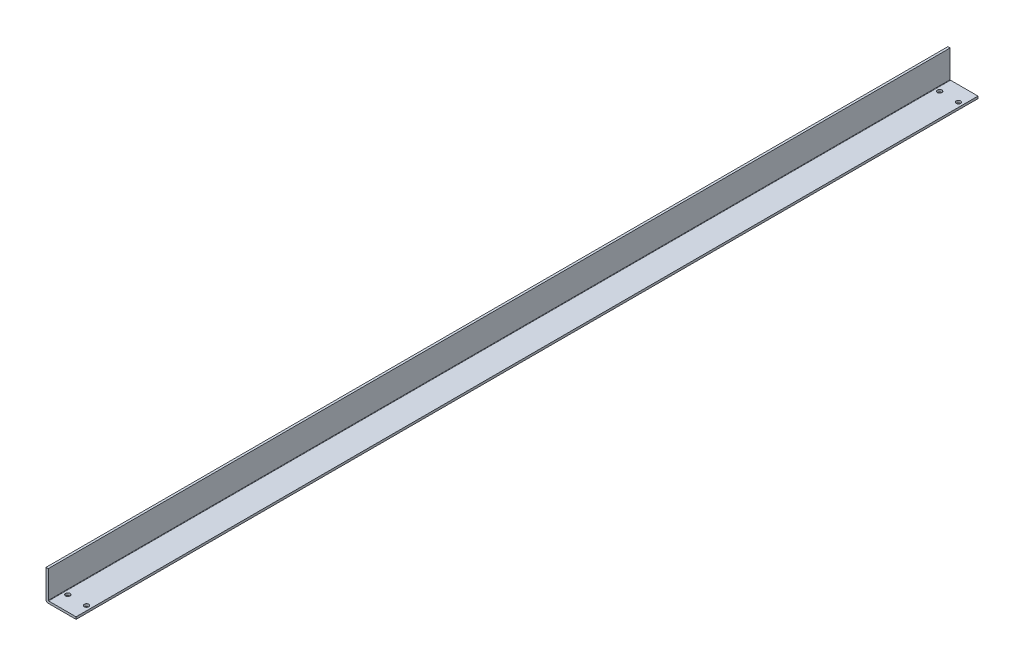
ISO-10303-21;
HEADER;
FILE_DESCRIPTION(('STEP AP214'),'2;1');
FILE_NAME('part.step','',(''),(''),'','','');
FILE_SCHEMA(('AUTOMOTIVE_DESIGN { 1 0 10303 214 1 1 1 1 }'));
ENDSEC;
DATA;
#1=APPLICATION_CONTEXT('core data for automotive mechanical design processes');
#2=APPLICATION_PROTOCOL_DEFINITION('international standard','automotive_design',2000,#1);
#3=PRODUCT_CONTEXT('',#1,'mechanical');
#4=PRODUCT('Part','Part','',(#3));
#5=PRODUCT_RELATED_PRODUCT_CATEGORY('part','',(#4));
#6=PRODUCT_DEFINITION_FORMATION('','',#4);
#7=PRODUCT_DEFINITION_CONTEXT('part definition',#1,'design');
#8=PRODUCT_DEFINITION('design','',#6,#7);
#9=PRODUCT_DEFINITION_SHAPE('','',#8);
#10=(LENGTH_UNIT() NAMED_UNIT(*) SI_UNIT(.MILLI.,.METRE.));
#11=(NAMED_UNIT(*) PLANE_ANGLE_UNIT() SI_UNIT($,.RADIAN.));
#12=(NAMED_UNIT(*) SI_UNIT($,.STERADIAN.) SOLID_ANGLE_UNIT());
#13=UNCERTAINTY_MEASURE_WITH_UNIT(LENGTH_MEASURE(1.E-05),#10,'distance_accuracy_value','');
#14=(GEOMETRIC_REPRESENTATION_CONTEXT(3) GLOBAL_UNCERTAINTY_ASSIGNED_CONTEXT((#13)) GLOBAL_UNIT_ASSIGNED_CONTEXT((#10,
#11,#12)) REPRESENTATION_CONTEXT('',''));
#15=CARTESIAN_POINT('',(0.,0.,0.));
#16=DIRECTION('',(0.,0.,1.));
#17=DIRECTION('',(1.,0.,0.));
#18=AXIS2_PLACEMENT_3D('',#15,#16,#17);
#19=CARTESIAN_POINT('',(0.,40.,1200.));
#20=DIRECTION('',(0.,-1.,0.));
#21=DIRECTION('',(0.,0.,-1.));
#22=AXIS2_PLACEMENT_3D('',#19,#20,#21);
#23=PLANE('',#22);
#24=DIRECTION('',(-1.,0.,0.));
#25=VECTOR('',#24,1.);
#26=CARTESIAN_POINT('',(0.,40.,0.));
#27=LINE('',#26,#25);
#28=CARTESIAN_POINT('',(3.,40.,0.));
#29=VERTEX_POINT('',#28);
#30=CARTESIAN_POINT('',(0.,40.,0.));
#31=VERTEX_POINT('',#30);
#32=EDGE_CURVE('E128',#29,#31,#27,.T.);
#33=ORIENTED_EDGE('',*,*,#32,.T.);
#34=DIRECTION('',(0.,0.,-1.));
#35=VECTOR('',#34,1.);
#36=CARTESIAN_POINT('',(0.,40.,1200.));
#37=LINE('',#36,#35);
#38=CARTESIAN_POINT('',(0.,40.,1200.));
#39=VERTEX_POINT('',#38);
#40=EDGE_CURVE('E11',#39,#31,#37,.T.);
#41=ORIENTED_EDGE('',*,*,#40,.F.);
#42=DIRECTION('',(-1.,0.,0.));
#43=VECTOR('',#42,1.);
#44=CARTESIAN_POINT('',(0.,40.,1200.));
#45=LINE('',#44,#43);
#46=CARTESIAN_POINT('',(3.,40.,1200.));
#47=VERTEX_POINT('',#46);
#48=EDGE_CURVE('E143',#47,#39,#45,.T.);
#49=ORIENTED_EDGE('',*,*,#48,.F.);
#50=DIRECTION('',(0.,0.,-1.));
#51=VECTOR('',#50,1.);
#52=CARTESIAN_POINT('',(3.,40.,1200.));
#53=LINE('',#52,#51);
#54=EDGE_CURVE('E124',#47,#29,#53,.T.);
#55=ORIENTED_EDGE('',*,*,#54,.T.);
#56=EDGE_LOOP('',(#33,#41,#49,#55));
#57=FACE_BOUND('',#56,.T.);
#58=ADVANCED_FACE('F32',(#57),#23,.F.);
#59=CARTESIAN_POINT('',(0.,3.00000000000002,1200.));
#60=DIRECTION('',(1.,0.,0.));
#61=DIRECTION('',(0.,0.,-1.));
#62=AXIS2_PLACEMENT_3D('',#59,#60,#61);
#63=PLANE('',#62);
#64=DIRECTION('',(0.,-1.,0.));
#65=VECTOR('',#64,1.);
#66=CARTESIAN_POINT('',(0.,3.00000000000002,0.));
#67=LINE('',#66,#65);
#68=CARTESIAN_POINT('',(0.,3.00000000000002,0.));
#69=VERTEX_POINT('',#68);
#70=EDGE_CURVE('E131',#31,#69,#67,.T.);
#71=ORIENTED_EDGE('',*,*,#70,.T.);
#72=DIRECTION('',(0.,0.,-1.));
#73=VECTOR('',#72,1.);
#74=CARTESIAN_POINT('',(0.,3.00000000000002,1200.));
#75=LINE('',#74,#73);
#76=CARTESIAN_POINT('',(0.,3.00000000000002,1200.));
#77=VERTEX_POINT('',#76);
#78=EDGE_CURVE('E40',#77,#69,#75,.T.);
#79=ORIENTED_EDGE('',*,*,#78,.F.);
#80=DIRECTION('',(0.,-1.,0.));
#81=VECTOR('',#80,1.);
#82=CARTESIAN_POINT('',(0.,3.00000000000002,1200.));
#83=LINE('',#82,#81);
#84=EDGE_CURVE('E91',#39,#77,#83,.T.);
#85=ORIENTED_EDGE('',*,*,#84,.F.);
#86=ORIENTED_EDGE('',*,*,#40,.T.);
#87=EDGE_LOOP('',(#71,#79,#85,#86));
#88=FACE_BOUND('',#87,.T.);
#89=ADVANCED_FACE('F227',(#88),#63,.F.);
#90=CARTESIAN_POINT('',(3.,3.,1200.));
#91=DIRECTION('',(0.,0.,-1.));
#92=DIRECTION('',(-1.,0.,0.));
#93=AXIS2_PLACEMENT_3D('',#90,#91,#92);
#94=CYLINDRICAL_SURFACE('',#93,3.);
#95=CARTESIAN_POINT('',(3.,3.,0.));
#96=DIRECTION('',(0.,0.,1.));
#97=DIRECTION('',(1.,0.,0.));
#98=AXIS2_PLACEMENT_3D('',#95,#96,#97);
#99=CIRCLE('',#98,3.);
#100=CARTESIAN_POINT('',(3.00000000000002,0.,0.));
#101=VERTEX_POINT('',#100);
#102=EDGE_CURVE('E134',#69,#101,#99,.T.);
#103=ORIENTED_EDGE('',*,*,#102,.T.);
#104=DIRECTION('',(0.,0.,-1.));
#105=VECTOR('',#104,1.);
#106=CARTESIAN_POINT('',(3.00000000000002,0.,1200.));
#107=LINE('',#106,#105);
#108=CARTESIAN_POINT('',(3.00000000000002,0.,1200.));
#109=VERTEX_POINT('',#108);
#110=EDGE_CURVE('E150',#109,#101,#107,.T.);
#111=ORIENTED_EDGE('',*,*,#110,.F.);
#112=CARTESIAN_POINT('',(3.,3.,1200.));
#113=DIRECTION('',(0.,0.,1.));
#114=DIRECTION('',(1.,0.,0.));
#115=AXIS2_PLACEMENT_3D('',#112,#113,#114);
#116=CIRCLE('',#115,3.);
#117=EDGE_CURVE('E158',#77,#109,#116,.T.);
#118=ORIENTED_EDGE('',*,*,#117,.F.);
#119=ORIENTED_EDGE('',*,*,#78,.T.);
#120=EDGE_LOOP('',(#103,#111,#118,#119));
#121=FACE_BOUND('',#120,.T.);
#122=ADVANCED_FACE('F156',(#121),#94,.T.);
#123=CARTESIAN_POINT('',(40.,0.,1200.));
#124=DIRECTION('',(0.,1.,0.));
#125=DIRECTION('',(0.,0.,1.));
#126=AXIS2_PLACEMENT_3D('',#123,#124,#125);
#127=PLANE('',#126);
#128=CARTESIAN_POINT('',(34.,0.,1180.));
#129=DIRECTION('',(0.,1.,0.));
#130=DIRECTION('',(0.,0.,1.));
#131=AXIS2_PLACEMENT_3D('',#128,#129,#130);
#132=CIRCLE('',#131,3.);
#133=CARTESIAN_POINT('',(34.,0.,1183.));
#134=VERTEX_POINT('',#133);
#135=EDGE_CURVE('E181',#134,#134,#132,.F.);
#136=ORIENTED_EDGE('',*,*,#135,.F.);
#137=EDGE_LOOP('',(#136));
#138=FACE_BOUND('',#137,.T.);
#139=CARTESIAN_POINT('',(9.,0.,20.));
#140=DIRECTION('',(0.,1.,0.));
#141=DIRECTION('',(0.,0.,1.));
#142=AXIS2_PLACEMENT_3D('',#139,#140,#141);
#143=CIRCLE('',#142,3.);
#144=CARTESIAN_POINT('',(9.,0.,23.));
#145=VERTEX_POINT('',#144);
#146=EDGE_CURVE('E189',#145,#145,#143,.F.);
#147=ORIENTED_EDGE('',*,*,#146,.F.);
#148=EDGE_LOOP('',(#147));
#149=FACE_BOUND('',#148,.T.);
#150=CARTESIAN_POINT('',(34.,0.,20.));
#151=DIRECTION('',(0.,1.,0.));
#152=DIRECTION('',(0.,0.,1.));
#153=AXIS2_PLACEMENT_3D('',#150,#151,#152);
#154=CIRCLE('',#153,3.);
#155=CARTESIAN_POINT('',(34.,0.,23.));
#156=VERTEX_POINT('',#155);
#157=EDGE_CURVE('E182',#156,#156,#154,.F.);
#158=ORIENTED_EDGE('',*,*,#157,.F.);
#159=EDGE_LOOP('',(#158));
#160=FACE_BOUND('',#159,.T.);
#161=CARTESIAN_POINT('',(9.,0.,1180.));
#162=DIRECTION('',(0.,1.,0.));
#163=DIRECTION('',(0.,0.,1.));
#164=AXIS2_PLACEMENT_3D('',#161,#162,#163);
#165=CIRCLE('',#164,3.);
#166=CARTESIAN_POINT('',(9.,0.,1183.));
#167=VERTEX_POINT('',#166);
#168=EDGE_CURVE('E132',#167,#167,#165,.F.);
#169=ORIENTED_EDGE('',*,*,#168,.F.);
#170=EDGE_LOOP('',(#169));
#171=FACE_BOUND('',#170,.T.);
#172=DIRECTION('',(1.,0.,0.));
#173=VECTOR('',#172,1.);
#174=CARTESIAN_POINT('',(40.,0.,0.));
#175=LINE('',#174,#173);
#176=CARTESIAN_POINT('',(40.,0.,0.));
#177=VERTEX_POINT('',#176);
#178=EDGE_CURVE('E136',#101,#177,#175,.T.);
#179=ORIENTED_EDGE('',*,*,#178,.T.);
#180=DIRECTION('',(0.,0.,-1.));
#181=VECTOR('',#180,1.);
#182=CARTESIAN_POINT('',(40.,0.,1200.));
#183=LINE('',#182,#181);
#184=CARTESIAN_POINT('',(40.,0.,1200.));
#185=VERTEX_POINT('',#184);
#186=EDGE_CURVE('E147',#185,#177,#183,.T.);
#187=ORIENTED_EDGE('',*,*,#186,.F.);
#188=DIRECTION('',(1.,0.,0.));
#189=VECTOR('',#188,1.);
#190=CARTESIAN_POINT('',(40.,0.,1200.));
#191=LINE('',#190,#189);
#192=EDGE_CURVE('E170',#109,#185,#191,.T.);
#193=ORIENTED_EDGE('',*,*,#192,.F.);
#194=ORIENTED_EDGE('',*,*,#110,.T.);
#195=EDGE_LOOP('',(#179,#187,#193,#194));
#196=FACE_BOUND('',#195,.T.);
#197=ADVANCED_FACE('F166',(#138,#149,#160,#171,#196),#127,.F.);
#198=CARTESIAN_POINT('',(40.,3.,1200.));
#199=DIRECTION('',(-1.,0.,0.));
#200=DIRECTION('',(0.,0.,1.));
#201=AXIS2_PLACEMENT_3D('',#198,#199,#200);
#202=PLANE('',#201);
#203=DIRECTION('',(0.,1.,0.));
#204=VECTOR('',#203,1.);
#205=CARTESIAN_POINT('',(40.,3.,0.));
#206=LINE('',#205,#204);
#207=CARTESIAN_POINT('',(40.,3.,0.));
#208=VERTEX_POINT('',#207);
#209=EDGE_CURVE('E138',#177,#208,#206,.T.);
#210=ORIENTED_EDGE('',*,*,#209,.T.);
#211=DIRECTION('',(0.,0.,-1.));
#212=VECTOR('',#211,1.);
#213=CARTESIAN_POINT('',(40.,3.,1200.));
#214=LINE('',#213,#212);
#215=CARTESIAN_POINT('',(40.,3.,1200.));
#216=VERTEX_POINT('',#215);
#217=EDGE_CURVE('E119',#216,#208,#214,.T.);
#218=ORIENTED_EDGE('',*,*,#217,.F.);
#219=DIRECTION('',(0.,1.,0.));
#220=VECTOR('',#219,1.);
#221=CARTESIAN_POINT('',(40.,3.,1200.));
#222=LINE('',#221,#220);
#223=EDGE_CURVE('E110',#185,#216,#222,.T.);
#224=ORIENTED_EDGE('',*,*,#223,.F.);
#225=ORIENTED_EDGE('',*,*,#186,.T.);
#226=EDGE_LOOP('',(#210,#218,#224,#225));
#227=FACE_BOUND('',#226,.T.);
#228=ADVANCED_FACE('F169',(#227),#202,.F.);
#229=CARTESIAN_POINT('',(3.50000000000001,3.,1200.));
#230=DIRECTION('',(0.,-1.,0.));
#231=DIRECTION('',(0.,0.,-1.));
#232=AXIS2_PLACEMENT_3D('',#229,#230,#231);
#233=PLANE('',#232);
#234=CARTESIAN_POINT('',(34.,3.,1180.));
#235=DIRECTION('',(0.,1.,0.));
#236=DIRECTION('',(0.,0.,1.));
#237=AXIS2_PLACEMENT_3D('',#234,#235,#236);
#238=CIRCLE('',#237,3.);
#239=CARTESIAN_POINT('',(34.,3.,1183.));
#240=VERTEX_POINT('',#239);
#241=EDGE_CURVE('E192',#240,#240,#238,.T.);
#242=ORIENTED_EDGE('',*,*,#241,.F.);
#243=EDGE_LOOP('',(#242));
#244=FACE_BOUND('',#243,.T.);
#245=CARTESIAN_POINT('',(9.,3.,20.));
#246=DIRECTION('',(0.,1.,0.));
#247=DIRECTION('',(0.,0.,1.));
#248=AXIS2_PLACEMENT_3D('',#245,#246,#247);
#249=CIRCLE('',#248,3.);
#250=CARTESIAN_POINT('',(9.,3.,23.));
#251=VERTEX_POINT('',#250);
#252=EDGE_CURVE('E185',#251,#251,#249,.T.);
#253=ORIENTED_EDGE('',*,*,#252,.F.);
#254=EDGE_LOOP('',(#253));
#255=FACE_BOUND('',#254,.T.);
#256=CARTESIAN_POINT('',(34.,3.,20.));
#257=DIRECTION('',(0.,1.,0.));
#258=DIRECTION('',(0.,0.,1.));
#259=AXIS2_PLACEMENT_3D('',#256,#257,#258);
#260=CIRCLE('',#259,3.);
#261=CARTESIAN_POINT('',(34.,3.,23.));
#262=VERTEX_POINT('',#261);
#263=EDGE_CURVE('E186',#262,#262,#260,.T.);
#264=ORIENTED_EDGE('',*,*,#263,.F.);
#265=EDGE_LOOP('',(#264));
#266=FACE_BOUND('',#265,.T.);
#267=CARTESIAN_POINT('',(9.,3.,1180.));
#268=DIRECTION('',(0.,1.,0.));
#269=DIRECTION('',(0.,0.,1.));
#270=AXIS2_PLACEMENT_3D('',#267,#268,#269);
#271=CIRCLE('',#270,3.);
#272=CARTESIAN_POINT('',(9.,3.,1183.));
#273=VERTEX_POINT('',#272);
#274=EDGE_CURVE('E178',#273,#273,#271,.T.);
#275=ORIENTED_EDGE('',*,*,#274,.F.);
#276=EDGE_LOOP('',(#275));
#277=FACE_BOUND('',#276,.T.);
#278=DIRECTION('',(-1.,0.,0.));
#279=VECTOR('',#278,1.);
#280=CARTESIAN_POINT('',(3.50000000000001,3.,0.));
#281=LINE('',#280,#279);
#282=CARTESIAN_POINT('',(3.50000000000001,3.,0.));
#283=VERTEX_POINT('',#282);
#284=EDGE_CURVE('E118',#208,#283,#281,.T.);
#285=ORIENTED_EDGE('',*,*,#284,.T.);
#286=DIRECTION('',(0.,0.,-1.));
#287=VECTOR('',#286,1.);
#288=CARTESIAN_POINT('',(3.50000000000001,3.,1200.));
#289=LINE('',#288,#287);
#290=CARTESIAN_POINT('',(3.50000000000001,3.,1200.));
#291=VERTEX_POINT('',#290);
#292=EDGE_CURVE('E115',#291,#283,#289,.T.);
#293=ORIENTED_EDGE('',*,*,#292,.F.);
#294=DIRECTION('',(-1.,0.,0.));
#295=VECTOR('',#294,1.);
#296=CARTESIAN_POINT('',(3.50000000000001,3.,1200.));
#297=LINE('',#296,#295);
#298=EDGE_CURVE('E104',#216,#291,#297,.T.);
#299=ORIENTED_EDGE('',*,*,#298,.F.);
#300=ORIENTED_EDGE('',*,*,#217,.T.);
#301=EDGE_LOOP('',(#285,#293,#299,#300));
#302=FACE_BOUND('',#301,.T.);
#303=ADVANCED_FACE('F116',(#244,#255,#266,#277,#302),#233,.F.);
#304=CARTESIAN_POINT('',(3.5,3.5,1200.));
#305=DIRECTION('',(0.,0.,-1.));
#306=DIRECTION('',(-1.,0.,0.));
#307=AXIS2_PLACEMENT_3D('',#304,#305,#306);
#308=CYLINDRICAL_SURFACE('',#307,0.5);
#309=CARTESIAN_POINT('',(3.5,3.5,0.));
#310=DIRECTION('',(0.,0.,-1.));
#311=DIRECTION('',(1.,0.,0.));
#312=AXIS2_PLACEMENT_3D('',#309,#310,#311);
#313=CIRCLE('',#312,0.5);
#314=CARTESIAN_POINT('',(3.,3.5,0.));
#315=VERTEX_POINT('',#314);
#316=EDGE_CURVE('E77',#283,#315,#313,.T.);
#317=ORIENTED_EDGE('',*,*,#316,.T.);
#318=DIRECTION('',(0.,0.,-1.));
#319=VECTOR('',#318,1.);
#320=CARTESIAN_POINT('',(3.,3.5,1200.));
#321=LINE('',#320,#319);
#322=CARTESIAN_POINT('',(3.,3.5,1200.));
#323=VERTEX_POINT('',#322);
#324=EDGE_CURVE('E120',#323,#315,#321,.T.);
#325=ORIENTED_EDGE('',*,*,#324,.F.);
#326=CARTESIAN_POINT('',(3.5,3.5,1200.));
#327=DIRECTION('',(0.,0.,-1.));
#328=DIRECTION('',(1.,0.,0.));
#329=AXIS2_PLACEMENT_3D('',#326,#327,#328);
#330=CIRCLE('',#329,0.5);
#331=EDGE_CURVE('E108',#291,#323,#330,.T.);
#332=ORIENTED_EDGE('',*,*,#331,.F.);
#333=ORIENTED_EDGE('',*,*,#292,.T.);
#334=EDGE_LOOP('',(#317,#325,#332,#333));
#335=FACE_BOUND('',#334,.T.);
#336=ADVANCED_FACE('F122',(#335),#308,.F.);
#337=CARTESIAN_POINT('',(3.,40.,1200.));
#338=DIRECTION('',(-1.,0.,0.));
#339=DIRECTION('',(0.,-1.,0.));
#340=AXIS2_PLACEMENT_3D('',#337,#338,#339);
#341=PLANE('',#340);
#342=DIRECTION('',(0.,1.,0.));
#343=VECTOR('',#342,1.);
#344=CARTESIAN_POINT('',(3.,40.,0.));
#345=LINE('',#344,#343);
#346=EDGE_CURVE('E83',#315,#29,#345,.T.);
#347=ORIENTED_EDGE('',*,*,#346,.T.);
#348=ORIENTED_EDGE('',*,*,#54,.F.);
#349=DIRECTION('',(0.,1.,0.));
#350=VECTOR('',#349,1.);
#351=CARTESIAN_POINT('',(3.,40.,1200.));
#352=LINE('',#351,#350);
#353=EDGE_CURVE('E48',#323,#47,#352,.T.);
#354=ORIENTED_EDGE('',*,*,#353,.F.);
#355=ORIENTED_EDGE('',*,*,#324,.T.);
#356=EDGE_LOOP('',(#347,#348,#354,#355));
#357=FACE_BOUND('',#356,.T.);
#358=ADVANCED_FACE('F238',(#357),#341,.F.);
#359=CARTESIAN_POINT('',(3.5,3.5,1200.));
#360=DIRECTION('',(0.,0.,1.));
#361=DIRECTION('',(1.,0.,0.));
#362=AXIS2_PLACEMENT_3D('',#359,#360,#361);
#363=PLANE('',#362);
#364=ORIENTED_EDGE('',*,*,#48,.T.);
#365=ORIENTED_EDGE('',*,*,#84,.T.);
#366=ORIENTED_EDGE('',*,*,#117,.T.);
#367=ORIENTED_EDGE('',*,*,#192,.T.);
#368=ORIENTED_EDGE('',*,*,#223,.T.);
#369=ORIENTED_EDGE('',*,*,#298,.T.);
#370=ORIENTED_EDGE('',*,*,#331,.T.);
#371=ORIENTED_EDGE('',*,*,#353,.T.);
#372=EDGE_LOOP('',(#364,#365,#366,#367,#368,#369,#370,#371));
#373=FACE_BOUND('',#372,.T.);
#374=ADVANCED_FACE('F106',(#373),#363,.T.);
#375=CARTESIAN_POINT('',(3.5,3.5,0.));
#376=DIRECTION('',(0.,0.,1.));
#377=DIRECTION('',(1.,0.,0.));
#378=AXIS2_PLACEMENT_3D('',#375,#376,#377);
#379=PLANE('',#378);
#380=ORIENTED_EDGE('',*,*,#32,.F.);
#381=ORIENTED_EDGE('',*,*,#346,.F.);
#382=ORIENTED_EDGE('',*,*,#316,.F.);
#383=ORIENTED_EDGE('',*,*,#284,.F.);
#384=ORIENTED_EDGE('',*,*,#209,.F.);
#385=ORIENTED_EDGE('',*,*,#178,.F.);
#386=ORIENTED_EDGE('',*,*,#102,.F.);
#387=ORIENTED_EDGE('',*,*,#70,.F.);
#388=EDGE_LOOP('',(#380,#381,#382,#383,#384,#385,#386,#387));
#389=FACE_BOUND('',#388,.T.);
#390=ADVANCED_FACE('F162',(#389),#379,.F.);
#391=CARTESIAN_POINT('',(9.,-0.00100000000000013,1180.));
#392=DIRECTION('',(0.,1.,0.));
#393=DIRECTION('',(0.,0.,1.));
#394=AXIS2_PLACEMENT_3D('',#391,#392,#393);
#395=CYLINDRICAL_SURFACE('',#394,3.);
#396=CARTESIAN_POINT('',(9.,3.,1183.));
#397=CARTESIAN_POINT('',(9.,2.96875,1183.));
#398=CARTESIAN_POINT('',(9.,2.9375,1183.));
#399=CARTESIAN_POINT('',(9.,2.875,1183.));
#400=CARTESIAN_POINT('',(9.,2.84375,1183.));
#401=CARTESIAN_POINT('',(9.,2.78125,1183.));
#402=CARTESIAN_POINT('',(9.,2.75,1183.));
#403=CARTESIAN_POINT('',(9.,2.6875,1183.));
#404=CARTESIAN_POINT('',(9.,2.65625,1183.));
#405=CARTESIAN_POINT('',(9.,2.59375,1183.));
#406=CARTESIAN_POINT('',(9.,2.5625,1183.));
#407=CARTESIAN_POINT('',(9.,2.5,1183.));
#408=CARTESIAN_POINT('',(9.,2.46875,1183.));
#409=CARTESIAN_POINT('',(9.,2.40625,1183.));
#410=CARTESIAN_POINT('',(9.,2.375,1183.));
#411=CARTESIAN_POINT('',(9.,2.3125,1183.));
#412=CARTESIAN_POINT('',(9.,2.28125,1183.));
#413=CARTESIAN_POINT('',(9.,2.21875,1183.));
#414=CARTESIAN_POINT('',(9.,2.1875,1183.));
#415=CARTESIAN_POINT('',(9.,2.125,1183.));
#416=CARTESIAN_POINT('',(9.,2.09375,1183.));
#417=CARTESIAN_POINT('',(9.,2.03125,1183.));
#418=CARTESIAN_POINT('',(9.,2.,1183.));
#419=CARTESIAN_POINT('',(9.,1.9375,1183.));
#420=CARTESIAN_POINT('',(9.,1.90625,1183.));
#421=CARTESIAN_POINT('',(9.,1.84375,1183.));
#422=CARTESIAN_POINT('',(9.,1.8125,1183.));
#423=CARTESIAN_POINT('',(9.,1.75,1183.));
#424=CARTESIAN_POINT('',(9.,1.71875,1183.));
#425=CARTESIAN_POINT('',(9.,1.65625,1183.));
#426=CARTESIAN_POINT('',(9.,1.625,1183.));
#427=CARTESIAN_POINT('',(9.,1.5625,1183.));
#428=CARTESIAN_POINT('',(9.,1.53125,1183.));
#429=CARTESIAN_POINT('',(9.,1.46875,1183.));
#430=CARTESIAN_POINT('',(9.,1.4375,1183.));
#431=CARTESIAN_POINT('',(9.,1.375,1183.));
#432=CARTESIAN_POINT('',(9.,1.34375,1183.));
#433=CARTESIAN_POINT('',(9.,1.28125,1183.));
#434=CARTESIAN_POINT('',(9.,1.25,1183.));
#435=CARTESIAN_POINT('',(9.,1.1875,1183.));
#436=CARTESIAN_POINT('',(9.,1.15625,1183.));
#437=CARTESIAN_POINT('',(9.,1.09375,1183.));
#438=CARTESIAN_POINT('',(9.,1.0625,1183.));
#439=CARTESIAN_POINT('',(9.,1.,1183.));
#440=CARTESIAN_POINT('',(9.,0.96875,1183.));
#441=CARTESIAN_POINT('',(9.,0.90625,1183.));
#442=CARTESIAN_POINT('',(9.,0.875,1183.));
#443=CARTESIAN_POINT('',(9.,0.8125,1183.));
#444=CARTESIAN_POINT('',(9.,0.78125,1183.));
#445=CARTESIAN_POINT('',(9.,0.71875,1183.));
#446=CARTESIAN_POINT('',(9.,0.6875,1183.));
#447=CARTESIAN_POINT('',(9.,0.625,1183.));
#448=CARTESIAN_POINT('',(9.,0.59375,1183.));
#449=CARTESIAN_POINT('',(9.,0.53125,1183.));
#450=CARTESIAN_POINT('',(9.,0.5,1183.));
#451=CARTESIAN_POINT('',(9.,0.4375,1183.));
#452=CARTESIAN_POINT('',(9.,0.40625,1183.));
#453=CARTESIAN_POINT('',(9.,0.34375,1183.));
#454=CARTESIAN_POINT('',(9.,0.3125,1183.));
#455=CARTESIAN_POINT('',(9.,0.25,1183.));
#456=CARTESIAN_POINT('',(9.,0.21875,1183.));
#457=CARTESIAN_POINT('',(9.,0.15625,1183.));
#458=CARTESIAN_POINT('',(9.,0.125,1183.));
#459=CARTESIAN_POINT('',(9.,0.0625000000000001,1183.));
#460=CARTESIAN_POINT('',(9.,0.0312500000000001,1183.));
#461=CARTESIAN_POINT('',(9.,0.,1183.));
#462=B_SPLINE_CURVE_WITH_KNOTS('',3,(#396,#397,#398,#399,#400,#401,#402,#403,#404,#405,#406,
#407,#408,#409,#410,#411,#412,#413,#414,#415,#416,#417,#418,#419,#420,#421,#422,#423,#424,#425,
#426,#427,#428,#429,#430,#431,#432,#433,#434,#435,#436,#437,#438,#439,#440,#441,#442,#443,#444,
#445,#446,#447,#448,#449,#450,#451,#452,#453,#454,#455,#456,#457,#458,#459,#460,#461),
.UNSPECIFIED.,.F.,.F.,(4,2,2,2,2,2,2,2,2,2,2,2,2,2,2,2,2,2,2,2,2,2,2,2,2,2,2,2,2,2,2,2,4),(0.,
0.0937500000000001,0.1875,0.28125,0.375,0.46875,0.5625,0.65625,0.75,0.84375,0.9375,1.03125,
1.125,1.21875,1.3125,1.40625,1.5,1.59375,1.6875,1.78125,1.875,1.96875,2.0625,2.15625,2.25,
2.34375,2.4375,2.53125,2.625,2.71875,2.8125,2.90625,3.),.UNSPECIFIED.);
#463=EDGE_CURVE('BSEAM212',#273,#167,#462,.T.);
#464=ORIENTED_EDGE('',*,*,#274,.T.);
#465=ORIENTED_EDGE('',*,*,#168,.T.);
#466=ORIENTED_EDGE('',*,*,#463,.T.);
#467=ORIENTED_EDGE('',*,*,#463,.F.);
#468=EDGE_LOOP('',(#464,#466,#465,#467));
#469=FACE_BOUND('',#468,.T.);
#470=ADVANCED_FACE('F212',(#469),#395,.F.);
#471=CARTESIAN_POINT('',(34.,-0.00100000000000013,20.));
#472=DIRECTION('',(0.,1.,0.));
#473=DIRECTION('',(0.,0.,1.));
#474=AXIS2_PLACEMENT_3D('',#471,#472,#473);
#475=CYLINDRICAL_SURFACE('',#474,3.);
#476=CARTESIAN_POINT('',(34.,3.,23.));
#477=CARTESIAN_POINT('',(34.,2.96875,23.));
#478=CARTESIAN_POINT('',(34.,2.9375,23.));
#479=CARTESIAN_POINT('',(34.,2.875,23.));
#480=CARTESIAN_POINT('',(34.,2.84375,23.));
#481=CARTESIAN_POINT('',(34.,2.78125,23.));
#482=CARTESIAN_POINT('',(34.,2.75,23.));
#483=CARTESIAN_POINT('',(34.,2.6875,23.));
#484=CARTESIAN_POINT('',(34.,2.65625,23.));
#485=CARTESIAN_POINT('',(34.,2.59375,23.));
#486=CARTESIAN_POINT('',(34.,2.5625,23.));
#487=CARTESIAN_POINT('',(34.,2.5,23.));
#488=CARTESIAN_POINT('',(34.,2.46875,23.));
#489=CARTESIAN_POINT('',(34.,2.40625,23.));
#490=CARTESIAN_POINT('',(34.,2.375,23.));
#491=CARTESIAN_POINT('',(34.,2.3125,23.));
#492=CARTESIAN_POINT('',(34.,2.28125,23.));
#493=CARTESIAN_POINT('',(34.,2.21875,23.));
#494=CARTESIAN_POINT('',(34.,2.1875,23.));
#495=CARTESIAN_POINT('',(34.,2.125,23.));
#496=CARTESIAN_POINT('',(34.,2.09375,23.));
#497=CARTESIAN_POINT('',(34.,2.03125,23.));
#498=CARTESIAN_POINT('',(34.,2.,23.));
#499=CARTESIAN_POINT('',(34.,1.9375,23.));
#500=CARTESIAN_POINT('',(34.,1.90625,23.));
#501=CARTESIAN_POINT('',(34.,1.84375,23.));
#502=CARTESIAN_POINT('',(34.,1.8125,23.));
#503=CARTESIAN_POINT('',(34.,1.75,23.));
#504=CARTESIAN_POINT('',(34.,1.71875,23.));
#505=CARTESIAN_POINT('',(34.,1.65625,23.));
#506=CARTESIAN_POINT('',(34.,1.625,23.));
#507=CARTESIAN_POINT('',(34.,1.5625,23.));
#508=CARTESIAN_POINT('',(34.,1.53125,23.));
#509=CARTESIAN_POINT('',(34.,1.46875,23.));
#510=CARTESIAN_POINT('',(34.,1.4375,23.));
#511=CARTESIAN_POINT('',(34.,1.375,23.));
#512=CARTESIAN_POINT('',(34.,1.34375,23.));
#513=CARTESIAN_POINT('',(34.,1.28125,23.));
#514=CARTESIAN_POINT('',(34.,1.25,23.));
#515=CARTESIAN_POINT('',(34.,1.1875,23.));
#516=CARTESIAN_POINT('',(34.,1.15625,23.));
#517=CARTESIAN_POINT('',(34.,1.09375,23.));
#518=CARTESIAN_POINT('',(34.,1.0625,23.));
#519=CARTESIAN_POINT('',(34.,1.,23.));
#520=CARTESIAN_POINT('',(34.,0.96875,23.));
#521=CARTESIAN_POINT('',(34.,0.90625,23.));
#522=CARTESIAN_POINT('',(34.,0.875,23.));
#523=CARTESIAN_POINT('',(34.,0.8125,23.));
#524=CARTESIAN_POINT('',(34.,0.78125,23.));
#525=CARTESIAN_POINT('',(34.,0.71875,23.));
#526=CARTESIAN_POINT('',(34.,0.6875,23.));
#527=CARTESIAN_POINT('',(34.,0.625,23.));
#528=CARTESIAN_POINT('',(34.,0.59375,23.));
#529=CARTESIAN_POINT('',(34.,0.53125,23.));
#530=CARTESIAN_POINT('',(34.,0.5,23.));
#531=CARTESIAN_POINT('',(34.,0.4375,23.));
#532=CARTESIAN_POINT('',(34.,0.40625,23.));
#533=CARTESIAN_POINT('',(34.,0.34375,23.));
#534=CARTESIAN_POINT('',(34.,0.3125,23.));
#535=CARTESIAN_POINT('',(34.,0.25,23.));
#536=CARTESIAN_POINT('',(34.,0.21875,23.));
#537=CARTESIAN_POINT('',(34.,0.15625,23.));
#538=CARTESIAN_POINT('',(34.,0.125,23.));
#539=CARTESIAN_POINT('',(34.,0.0625000000000001,23.));
#540=CARTESIAN_POINT('',(34.,0.0312500000000001,23.));
#541=CARTESIAN_POINT('',(34.,0.,23.));
#542=B_SPLINE_CURVE_WITH_KNOTS('',3,(#476,#477,#478,#479,#480,#481,#482,#483,#484,#485,#486,
#487,#488,#489,#490,#491,#492,#493,#494,#495,#496,#497,#498,#499,#500,#501,#502,#503,#504,#505,
#506,#507,#508,#509,#510,#511,#512,#513,#514,#515,#516,#517,#518,#519,#520,#521,#522,#523,#524,
#525,#526,#527,#528,#529,#530,#531,#532,#533,#534,#535,#536,#537,#538,#539,#540,#541),
.UNSPECIFIED.,.F.,.F.,(4,2,2,2,2,2,2,2,2,2,2,2,2,2,2,2,2,2,2,2,2,2,2,2,2,2,2,2,2,2,2,2,4),(0.,
0.0937500000000001,0.1875,0.28125,0.375,0.46875,0.5625,0.65625,0.75,0.84375,0.9375,1.03125,
1.125,1.21875,1.3125,1.40625,1.5,1.59375,1.6875,1.78125,1.875,1.96875,2.0625,2.15625,2.25,
2.34375,2.4375,2.53125,2.625,2.71875,2.8125,2.90625,3.),.UNSPECIFIED.);
#543=EDGE_CURVE('BSEAM215',#262,#156,#542,.T.);
#544=ORIENTED_EDGE('',*,*,#263,.T.);
#545=ORIENTED_EDGE('',*,*,#157,.T.);
#546=ORIENTED_EDGE('',*,*,#543,.T.);
#547=ORIENTED_EDGE('',*,*,#543,.F.);
#548=EDGE_LOOP('',(#544,#546,#545,#547));
#549=FACE_BOUND('',#548,.T.);
#550=ADVANCED_FACE('F215',(#549),#475,.F.);
#551=CARTESIAN_POINT('',(9.,-0.00100000000000013,20.));
#552=DIRECTION('',(0.,1.,0.));
#553=DIRECTION('',(0.,0.,1.));
#554=AXIS2_PLACEMENT_3D('',#551,#552,#553);
#555=CYLINDRICAL_SURFACE('',#554,3.);
#556=CARTESIAN_POINT('',(9.,3.,23.));
#557=CARTESIAN_POINT('',(9.,2.96875,23.));
#558=CARTESIAN_POINT('',(9.,2.9375,23.));
#559=CARTESIAN_POINT('',(9.,2.875,23.));
#560=CARTESIAN_POINT('',(9.,2.84375,23.));
#561=CARTESIAN_POINT('',(9.,2.78125,23.));
#562=CARTESIAN_POINT('',(9.,2.75,23.));
#563=CARTESIAN_POINT('',(9.,2.6875,23.));
#564=CARTESIAN_POINT('',(9.,2.65625,23.));
#565=CARTESIAN_POINT('',(9.,2.59375,23.));
#566=CARTESIAN_POINT('',(9.,2.5625,23.));
#567=CARTESIAN_POINT('',(9.,2.5,23.));
#568=CARTESIAN_POINT('',(9.,2.46875,23.));
#569=CARTESIAN_POINT('',(9.,2.40625,23.));
#570=CARTESIAN_POINT('',(9.,2.375,23.));
#571=CARTESIAN_POINT('',(9.,2.3125,23.));
#572=CARTESIAN_POINT('',(9.,2.28125,23.));
#573=CARTESIAN_POINT('',(9.,2.21875,23.));
#574=CARTESIAN_POINT('',(9.,2.1875,23.));
#575=CARTESIAN_POINT('',(9.,2.125,23.));
#576=CARTESIAN_POINT('',(9.,2.09375,23.));
#577=CARTESIAN_POINT('',(9.,2.03125,23.));
#578=CARTESIAN_POINT('',(9.,2.,23.));
#579=CARTESIAN_POINT('',(9.,1.9375,23.));
#580=CARTESIAN_POINT('',(9.,1.90625,23.));
#581=CARTESIAN_POINT('',(9.,1.84375,23.));
#582=CARTESIAN_POINT('',(9.,1.8125,23.));
#583=CARTESIAN_POINT('',(9.,1.75,23.));
#584=CARTESIAN_POINT('',(9.,1.71875,23.));
#585=CARTESIAN_POINT('',(9.,1.65625,23.));
#586=CARTESIAN_POINT('',(9.,1.625,23.));
#587=CARTESIAN_POINT('',(9.,1.5625,23.));
#588=CARTESIAN_POINT('',(9.,1.53125,23.));
#589=CARTESIAN_POINT('',(9.,1.46875,23.));
#590=CARTESIAN_POINT('',(9.,1.4375,23.));
#591=CARTESIAN_POINT('',(9.,1.375,23.));
#592=CARTESIAN_POINT('',(9.,1.34375,23.));
#593=CARTESIAN_POINT('',(9.,1.28125,23.));
#594=CARTESIAN_POINT('',(9.,1.25,23.));
#595=CARTESIAN_POINT('',(9.,1.1875,23.));
#596=CARTESIAN_POINT('',(9.,1.15625,23.));
#597=CARTESIAN_POINT('',(9.,1.09375,23.));
#598=CARTESIAN_POINT('',(9.,1.0625,23.));
#599=CARTESIAN_POINT('',(9.,1.,23.));
#600=CARTESIAN_POINT('',(9.,0.96875,23.));
#601=CARTESIAN_POINT('',(9.,0.90625,23.));
#602=CARTESIAN_POINT('',(9.,0.875,23.));
#603=CARTESIAN_POINT('',(9.,0.8125,23.));
#604=CARTESIAN_POINT('',(9.,0.78125,23.));
#605=CARTESIAN_POINT('',(9.,0.71875,23.));
#606=CARTESIAN_POINT('',(9.,0.6875,23.));
#607=CARTESIAN_POINT('',(9.,0.625,23.));
#608=CARTESIAN_POINT('',(9.,0.59375,23.));
#609=CARTESIAN_POINT('',(9.,0.53125,23.));
#610=CARTESIAN_POINT('',(9.,0.5,23.));
#611=CARTESIAN_POINT('',(9.,0.4375,23.));
#612=CARTESIAN_POINT('',(9.,0.40625,23.));
#613=CARTESIAN_POINT('',(9.,0.34375,23.));
#614=CARTESIAN_POINT('',(9.,0.3125,23.));
#615=CARTESIAN_POINT('',(9.,0.25,23.));
#616=CARTESIAN_POINT('',(9.,0.21875,23.));
#617=CARTESIAN_POINT('',(9.,0.15625,23.));
#618=CARTESIAN_POINT('',(9.,0.125,23.));
#619=CARTESIAN_POINT('',(9.,0.0625000000000001,23.));
#620=CARTESIAN_POINT('',(9.,0.0312500000000001,23.));
#621=CARTESIAN_POINT('',(9.,0.,23.));
#622=B_SPLINE_CURVE_WITH_KNOTS('',3,(#556,#557,#558,#559,#560,#561,#562,#563,#564,#565,#566,
#567,#568,#569,#570,#571,#572,#573,#574,#575,#576,#577,#578,#579,#580,#581,#582,#583,#584,#585,
#586,#587,#588,#589,#590,#591,#592,#593,#594,#595,#596,#597,#598,#599,#600,#601,#602,#603,#604,
#605,#606,#607,#608,#609,#610,#611,#612,#613,#614,#615,#616,#617,#618,#619,#620,#621),
.UNSPECIFIED.,.F.,.F.,(4,2,2,2,2,2,2,2,2,2,2,2,2,2,2,2,2,2,2,2,2,2,2,2,2,2,2,2,2,2,2,2,4),(0.,
0.0937500000000001,0.1875,0.28125,0.375,0.46875,0.5625,0.65625,0.75,0.84375,0.9375,1.03125,
1.125,1.21875,1.3125,1.40625,1.5,1.59375,1.6875,1.78125,1.875,1.96875,2.0625,2.15625,2.25,
2.34375,2.4375,2.53125,2.625,2.71875,2.8125,2.90625,3.),.UNSPECIFIED.);
#623=EDGE_CURVE('BSEAM252',#251,#145,#622,.T.);
#624=ORIENTED_EDGE('',*,*,#252,.T.);
#625=ORIENTED_EDGE('',*,*,#146,.T.);
#626=ORIENTED_EDGE('',*,*,#623,.T.);
#627=ORIENTED_EDGE('',*,*,#623,.F.);
#628=EDGE_LOOP('',(#624,#626,#625,#627));
#629=FACE_BOUND('',#628,.T.);
#630=ADVANCED_FACE('F252',(#629),#555,.F.);
#631=CARTESIAN_POINT('',(34.,-0.00100000000000013,1180.));
#632=DIRECTION('',(0.,1.,0.));
#633=DIRECTION('',(0.,0.,1.));
#634=AXIS2_PLACEMENT_3D('',#631,#632,#633);
#635=CYLINDRICAL_SURFACE('',#634,3.);
#636=CARTESIAN_POINT('',(34.,3.,1183.));
#637=CARTESIAN_POINT('',(34.,2.96875,1183.));
#638=CARTESIAN_POINT('',(34.,2.9375,1183.));
#639=CARTESIAN_POINT('',(34.,2.875,1183.));
#640=CARTESIAN_POINT('',(34.,2.84375,1183.));
#641=CARTESIAN_POINT('',(34.,2.78125,1183.));
#642=CARTESIAN_POINT('',(34.,2.75,1183.));
#643=CARTESIAN_POINT('',(34.,2.6875,1183.));
#644=CARTESIAN_POINT('',(34.,2.65625,1183.));
#645=CARTESIAN_POINT('',(34.,2.59375,1183.));
#646=CARTESIAN_POINT('',(34.,2.5625,1183.));
#647=CARTESIAN_POINT('',(34.,2.5,1183.));
#648=CARTESIAN_POINT('',(34.,2.46875,1183.));
#649=CARTESIAN_POINT('',(34.,2.40625,1183.));
#650=CARTESIAN_POINT('',(34.,2.375,1183.));
#651=CARTESIAN_POINT('',(34.,2.3125,1183.));
#652=CARTESIAN_POINT('',(34.,2.28125,1183.));
#653=CARTESIAN_POINT('',(34.,2.21875,1183.));
#654=CARTESIAN_POINT('',(34.,2.1875,1183.));
#655=CARTESIAN_POINT('',(34.,2.125,1183.));
#656=CARTESIAN_POINT('',(34.,2.09375,1183.));
#657=CARTESIAN_POINT('',(34.,2.03125,1183.));
#658=CARTESIAN_POINT('',(34.,2.,1183.));
#659=CARTESIAN_POINT('',(34.,1.9375,1183.));
#660=CARTESIAN_POINT('',(34.,1.90625,1183.));
#661=CARTESIAN_POINT('',(34.,1.84375,1183.));
#662=CARTESIAN_POINT('',(34.,1.8125,1183.));
#663=CARTESIAN_POINT('',(34.,1.75,1183.));
#664=CARTESIAN_POINT('',(34.,1.71875,1183.));
#665=CARTESIAN_POINT('',(34.,1.65625,1183.));
#666=CARTESIAN_POINT('',(34.,1.625,1183.));
#667=CARTESIAN_POINT('',(34.,1.5625,1183.));
#668=CARTESIAN_POINT('',(34.,1.53125,1183.));
#669=CARTESIAN_POINT('',(34.,1.46875,1183.));
#670=CARTESIAN_POINT('',(34.,1.4375,1183.));
#671=CARTESIAN_POINT('',(34.,1.375,1183.));
#672=CARTESIAN_POINT('',(34.,1.34375,1183.));
#673=CARTESIAN_POINT('',(34.,1.28125,1183.));
#674=CARTESIAN_POINT('',(34.,1.25,1183.));
#675=CARTESIAN_POINT('',(34.,1.1875,1183.));
#676=CARTESIAN_POINT('',(34.,1.15625,1183.));
#677=CARTESIAN_POINT('',(34.,1.09375,1183.));
#678=CARTESIAN_POINT('',(34.,1.0625,1183.));
#679=CARTESIAN_POINT('',(34.,1.,1183.));
#680=CARTESIAN_POINT('',(34.,0.96875,1183.));
#681=CARTESIAN_POINT('',(34.,0.90625,1183.));
#682=CARTESIAN_POINT('',(34.,0.875,1183.));
#683=CARTESIAN_POINT('',(34.,0.8125,1183.));
#684=CARTESIAN_POINT('',(34.,0.78125,1183.));
#685=CARTESIAN_POINT('',(34.,0.71875,1183.));
#686=CARTESIAN_POINT('',(34.,0.6875,1183.));
#687=CARTESIAN_POINT('',(34.,0.625,1183.));
#688=CARTESIAN_POINT('',(34.,0.59375,1183.));
#689=CARTESIAN_POINT('',(34.,0.53125,1183.));
#690=CARTESIAN_POINT('',(34.,0.5,1183.));
#691=CARTESIAN_POINT('',(34.,0.4375,1183.));
#692=CARTESIAN_POINT('',(34.,0.40625,1183.));
#693=CARTESIAN_POINT('',(34.,0.34375,1183.));
#694=CARTESIAN_POINT('',(34.,0.3125,1183.));
#695=CARTESIAN_POINT('',(34.,0.25,1183.));
#696=CARTESIAN_POINT('',(34.,0.21875,1183.));
#697=CARTESIAN_POINT('',(34.,0.15625,1183.));
#698=CARTESIAN_POINT('',(34.,0.125,1183.));
#699=CARTESIAN_POINT('',(34.,0.0625000000000001,1183.));
#700=CARTESIAN_POINT('',(34.,0.0312500000000001,1183.));
#701=CARTESIAN_POINT('',(34.,0.,1183.));
#702=B_SPLINE_CURVE_WITH_KNOTS('',3,(#636,#637,#638,#639,#640,#641,#642,#643,#644,#645,#646,
#647,#648,#649,#650,#651,#652,#653,#654,#655,#656,#657,#658,#659,#660,#661,#662,#663,#664,#665,
#666,#667,#668,#669,#670,#671,#672,#673,#674,#675,#676,#677,#678,#679,#680,#681,#682,#683,#684,
#685,#686,#687,#688,#689,#690,#691,#692,#693,#694,#695,#696,#697,#698,#699,#700,#701),
.UNSPECIFIED.,.F.,.F.,(4,2,2,2,2,2,2,2,2,2,2,2,2,2,2,2,2,2,2,2,2,2,2,2,2,2,2,2,2,2,2,2,4),(0.,
0.0937500000000001,0.1875,0.28125,0.375,0.46875,0.5625,0.65625,0.75,0.84375,0.9375,1.03125,
1.125,1.21875,1.3125,1.40625,1.5,1.59375,1.6875,1.78125,1.875,1.96875,2.0625,2.15625,2.25,
2.34375,2.4375,2.53125,2.625,2.71875,2.8125,2.90625,3.),.UNSPECIFIED.);
#703=EDGE_CURVE('BSEAM200',#240,#134,#702,.T.);
#704=ORIENTED_EDGE('',*,*,#241,.T.);
#705=ORIENTED_EDGE('',*,*,#135,.T.);
#706=ORIENTED_EDGE('',*,*,#703,.T.);
#707=ORIENTED_EDGE('',*,*,#703,.F.);
#708=EDGE_LOOP('',(#704,#706,#705,#707));
#709=FACE_BOUND('',#708,.T.);
#710=ADVANCED_FACE('F200',(#709),#635,.F.);
#711=CLOSED_SHELL('',(#58,#89,#122,#197,#228,#303,#336,#358,#374,#390,#470,#550,#630,#710));
#712=MANIFOLD_SOLID_BREP('B2',#711);
#713=ADVANCED_BREP_SHAPE_REPRESENTATION('',(#18,#712),#14);
#714=SHAPE_DEFINITION_REPRESENTATION(#9,#713);
ENDSEC;
END-ISO-10303-21;
